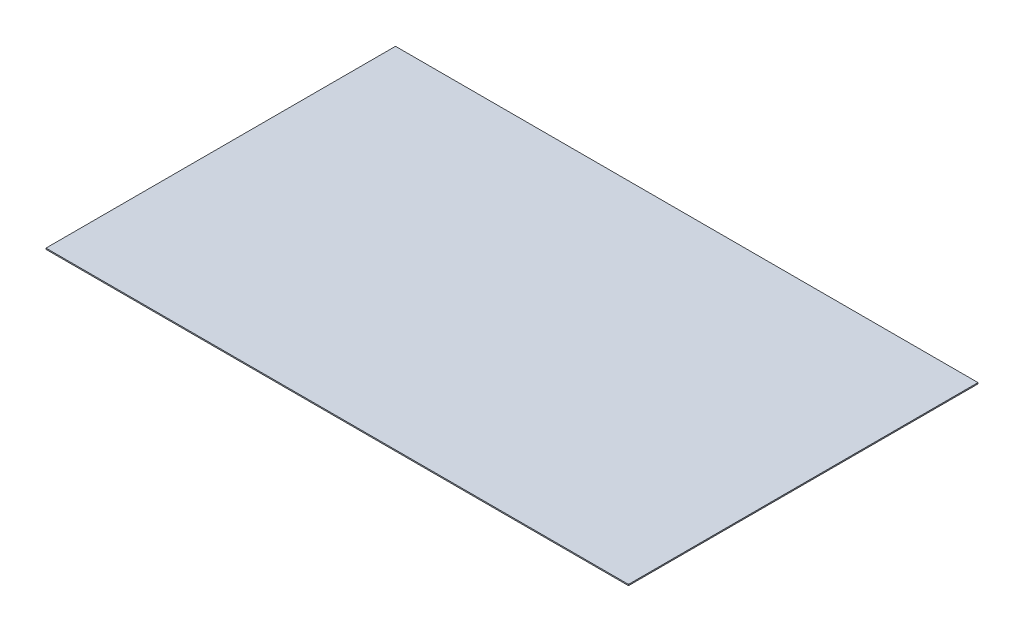
ISO-10303-21;
HEADER;
FILE_DESCRIPTION(('STEP AP214'),'2;1');
FILE_NAME('part.step','',(''),(''),'','','');
FILE_SCHEMA(('AUTOMOTIVE_DESIGN { 1 0 10303 214 1 1 1 1 }'));
ENDSEC;
DATA;
#1=APPLICATION_CONTEXT('core data for automotive mechanical design processes');
#2=APPLICATION_PROTOCOL_DEFINITION('international standard','automotive_design',2000,#1);
#3=PRODUCT_CONTEXT('',#1,'mechanical');
#4=PRODUCT('Part','Part','',(#3));
#5=PRODUCT_RELATED_PRODUCT_CATEGORY('part','',(#4));
#6=PRODUCT_DEFINITION_FORMATION('','',#4);
#7=PRODUCT_DEFINITION_CONTEXT('part definition',#1,'design');
#8=PRODUCT_DEFINITION('design','',#6,#7);
#9=PRODUCT_DEFINITION_SHAPE('','',#8);
#10=(LENGTH_UNIT() NAMED_UNIT(*) SI_UNIT(.MILLI.,.METRE.));
#11=(NAMED_UNIT(*) PLANE_ANGLE_UNIT() SI_UNIT($,.RADIAN.));
#12=(NAMED_UNIT(*) SI_UNIT($,.STERADIAN.) SOLID_ANGLE_UNIT());
#13=UNCERTAINTY_MEASURE_WITH_UNIT(LENGTH_MEASURE(1.E-05),#10,'distance_accuracy_value','');
#14=(GEOMETRIC_REPRESENTATION_CONTEXT(3) GLOBAL_UNCERTAINTY_ASSIGNED_CONTEXT((#13)) GLOBAL_UNIT_ASSIGNED_CONTEXT((#10,
#11,#12)) REPRESENTATION_CONTEXT('',''));
#15=CARTESIAN_POINT('',(0.,0.,0.));
#16=DIRECTION('',(0.,0.,1.));
#17=DIRECTION('',(1.,0.,0.));
#18=AXIS2_PLACEMENT_3D('',#15,#16,#17);
#19=CARTESIAN_POINT('',(-68.9594109807007,10.,-35.2909926783586));
#20=DIRECTION('',(1.,0.,0.));
#21=DIRECTION('',(0.,0.,-1.));
#22=AXIS2_PLACEMENT_3D('',#19,#20,#21);
#23=PLANE('',#22);
#24=DIRECTION('',(0.,0.,1.));
#25=VECTOR('',#24,1.);
#26=CARTESIAN_POINT('',(-68.9594109807007,0.,-35.2909926783586));
#27=LINE('',#26,#25);
#28=CARTESIAN_POINT('',(-68.9594109807007,0.,-35.2909926783586));
#29=VERTEX_POINT('',#28);
#30=CARTESIAN_POINT('',(-68.9594109807003,0.,2964.70900732164));
#31=VERTEX_POINT('',#30);
#32=EDGE_CURVE('E96',#29,#31,#27,.T.);
#33=ORIENTED_EDGE('',*,*,#32,.T.);
#34=DIRECTION('',(0.,-1.,0.));
#35=VECTOR('',#34,1.);
#36=CARTESIAN_POINT('',(-68.9594109807003,10.,2964.70900732164));
#37=LINE('',#36,#35);
#38=CARTESIAN_POINT('',(-68.9594109807003,10.,2964.70900732164));
#39=VERTEX_POINT('',#38);
#40=EDGE_CURVE('E11',#39,#31,#37,.T.);
#41=ORIENTED_EDGE('',*,*,#40,.F.);
#42=DIRECTION('',(0.,0.,1.));
#43=VECTOR('',#42,1.);
#44=CARTESIAN_POINT('',(-68.9594109807007,10.,-35.2909926783586));
#45=LINE('',#44,#43);
#46=CARTESIAN_POINT('',(-68.9594109807007,10.,-35.2909926783586));
#47=VERTEX_POINT('',#46);
#48=EDGE_CURVE('E84',#47,#39,#45,.T.);
#49=ORIENTED_EDGE('',*,*,#48,.F.);
#50=DIRECTION('',(0.,-1.,0.));
#51=VECTOR('',#50,1.);
#52=CARTESIAN_POINT('',(-68.9594109807007,10.,-35.2909926783586));
#53=LINE('',#52,#51);
#54=EDGE_CURVE('E92',#47,#29,#53,.T.);
#55=ORIENTED_EDGE('',*,*,#54,.T.);
#56=EDGE_LOOP('',(#33,#41,#49,#55));
#57=FACE_BOUND('',#56,.T.);
#58=ADVANCED_FACE('F33',(#57),#23,.F.);
#59=CARTESIAN_POINT('',(-68.9594109807003,10.,2964.70900732164));
#60=DIRECTION('',(0.,0.,-1.));
#61=DIRECTION('',(-1.,0.,0.));
#62=AXIS2_PLACEMENT_3D('',#59,#60,#61);
#63=PLANE('',#62);
#64=DIRECTION('',(1.,0.,0.));
#65=VECTOR('',#64,1.);
#66=CARTESIAN_POINT('',(-68.9594109807003,0.,2964.70900732164));
#67=LINE('',#66,#65);
#68=CARTESIAN_POINT('',(4931.0405890193,0.,2964.70900732164));
#69=VERTEX_POINT('',#68);
#70=EDGE_CURVE('E88',#31,#69,#67,.T.);
#71=ORIENTED_EDGE('',*,*,#70,.T.);
#72=DIRECTION('',(0.,-1.,0.));
#73=VECTOR('',#72,1.);
#74=CARTESIAN_POINT('',(4931.0405890193,10.,2964.70900732164));
#75=LINE('',#74,#73);
#76=CARTESIAN_POINT('',(4931.0405890193,10.,2964.70900732164));
#77=VERTEX_POINT('',#76);
#78=EDGE_CURVE('E41',#77,#69,#75,.T.);
#79=ORIENTED_EDGE('',*,*,#78,.F.);
#80=DIRECTION('',(1.,0.,0.));
#81=VECTOR('',#80,1.);
#82=CARTESIAN_POINT('',(-68.9594109807003,10.,2964.70900732164));
#83=LINE('',#82,#81);
#84=EDGE_CURVE('E79',#39,#77,#83,.T.);
#85=ORIENTED_EDGE('',*,*,#84,.F.);
#86=ORIENTED_EDGE('',*,*,#40,.T.);
#87=EDGE_LOOP('',(#71,#79,#85,#86));
#88=FACE_BOUND('',#87,.T.);
#89=ADVANCED_FACE('F87',(#88),#63,.F.);
#90=CARTESIAN_POINT('',(4931.0405890193,10.,-35.2909926783586));
#91=DIRECTION('',(-1.,0.,0.));
#92=DIRECTION('',(0.,0.,1.));
#93=AXIS2_PLACEMENT_3D('',#90,#91,#92);
#94=PLANE('',#93);
#95=DIRECTION('',(0.,0.,-1.));
#96=VECTOR('',#95,1.);
#97=CARTESIAN_POINT('',(4931.0405890193,0.,-35.2909926783586));
#98=LINE('',#97,#96);
#99=CARTESIAN_POINT('',(4931.0405890193,0.,-35.2909926783586));
#100=VERTEX_POINT('',#99);
#101=EDGE_CURVE('E66',#69,#100,#98,.T.);
#102=ORIENTED_EDGE('',*,*,#101,.T.);
#103=DIRECTION('',(0.,-1.,0.));
#104=VECTOR('',#103,1.);
#105=CARTESIAN_POINT('',(4931.0405890193,10.,-35.2909926783586));
#106=LINE('',#105,#104);
#107=CARTESIAN_POINT('',(4931.0405890193,10.,-35.2909926783586));
#108=VERTEX_POINT('',#107);
#109=EDGE_CURVE('E89',#108,#100,#106,.T.);
#110=ORIENTED_EDGE('',*,*,#109,.F.);
#111=DIRECTION('',(0.,0.,-1.));
#112=VECTOR('',#111,1.);
#113=CARTESIAN_POINT('',(4931.0405890193,10.,-35.2909926783586));
#114=LINE('',#113,#112);
#115=EDGE_CURVE('E82',#77,#108,#114,.T.);
#116=ORIENTED_EDGE('',*,*,#115,.F.);
#117=ORIENTED_EDGE('',*,*,#78,.T.);
#118=EDGE_LOOP('',(#102,#110,#116,#117));
#119=FACE_BOUND('',#118,.T.);
#120=ADVANCED_FACE('F90',(#119),#94,.F.);
#121=CARTESIAN_POINT('',(-68.9594109807007,10.,-35.2909926783586));
#122=DIRECTION('',(0.,0.,1.));
#123=DIRECTION('',(1.,0.,0.));
#124=AXIS2_PLACEMENT_3D('',#121,#122,#123);
#125=PLANE('',#124);
#126=DIRECTION('',(-1.,0.,0.));
#127=VECTOR('',#126,1.);
#128=CARTESIAN_POINT('',(-68.9594109807007,0.,-35.2909926783586));
#129=LINE('',#128,#127);
#130=EDGE_CURVE('E72',#100,#29,#129,.T.);
#131=ORIENTED_EDGE('',*,*,#130,.T.);
#132=ORIENTED_EDGE('',*,*,#54,.F.);
#133=DIRECTION('',(-1.,0.,0.));
#134=VECTOR('',#133,1.);
#135=CARTESIAN_POINT('',(-68.9594109807007,10.,-35.2909926783586));
#136=LINE('',#135,#134);
#137=EDGE_CURVE('E49',#108,#47,#136,.T.);
#138=ORIENTED_EDGE('',*,*,#137,.F.);
#139=ORIENTED_EDGE('',*,*,#109,.T.);
#140=EDGE_LOOP('',(#131,#132,#138,#139));
#141=FACE_BOUND('',#140,.T.);
#142=ADVANCED_FACE('F103',(#141),#125,.F.);
#143=CARTESIAN_POINT('',(0.,10.,0.));
#144=DIRECTION('',(0.,1.,0.));
#145=DIRECTION('',(0.,0.,1.));
#146=AXIS2_PLACEMENT_3D('',#143,#144,#145);
#147=PLANE('',#146);
#148=ORIENTED_EDGE('',*,*,#48,.T.);
#149=ORIENTED_EDGE('',*,*,#84,.T.);
#150=ORIENTED_EDGE('',*,*,#115,.T.);
#151=ORIENTED_EDGE('',*,*,#137,.T.);
#152=EDGE_LOOP('',(#148,#149,#150,#151));
#153=FACE_BOUND('',#152,.T.);
#154=ADVANCED_FACE('F80',(#153),#147,.T.);
#155=CARTESIAN_POINT('',(0.,0.,0.));
#156=DIRECTION('',(0.,1.,0.));
#157=DIRECTION('',(0.,0.,1.));
#158=AXIS2_PLACEMENT_3D('',#155,#156,#157);
#159=PLANE('',#158);
#160=ORIENTED_EDGE('',*,*,#32,.F.);
#161=ORIENTED_EDGE('',*,*,#130,.F.);
#162=ORIENTED_EDGE('',*,*,#101,.F.);
#163=ORIENTED_EDGE('',*,*,#70,.F.);
#164=EDGE_LOOP('',(#160,#161,#162,#163));
#165=FACE_BOUND('',#164,.T.);
#166=ADVANCED_FACE('F106',(#165),#159,.F.);
#167=CLOSED_SHELL('',(#58,#89,#120,#142,#154,#166));
#168=MANIFOLD_SOLID_BREP('B2',#167);
#169=ADVANCED_BREP_SHAPE_REPRESENTATION('',(#18,#168),#14);
#170=SHAPE_DEFINITION_REPRESENTATION(#9,#169);
ENDSEC;
END-ISO-10303-21;
